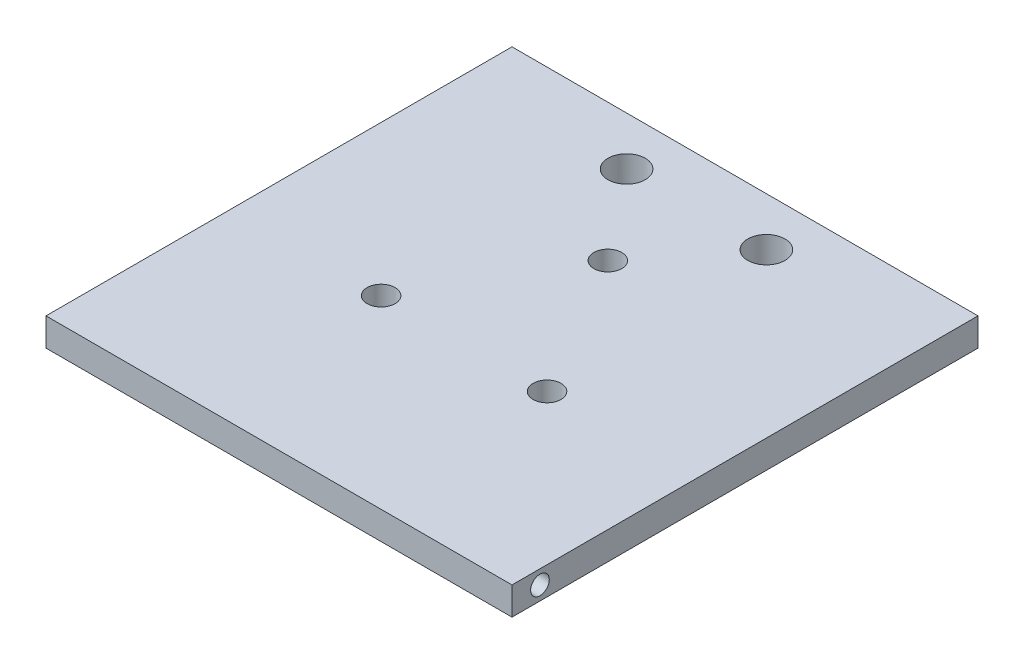
ISO-10303-21;
HEADER;
FILE_DESCRIPTION(('STEP AP214'),'2;1');
FILE_NAME('part.step','',(''),(''),'','','');
FILE_SCHEMA(('AUTOMOTIVE_DESIGN { 1 0 10303 214 1 1 1 1 }'));
ENDSEC;
DATA;
#1=APPLICATION_CONTEXT('core data for automotive mechanical design processes');
#2=APPLICATION_PROTOCOL_DEFINITION('international standard','automotive_design',2000,#1);
#3=PRODUCT_CONTEXT('',#1,'mechanical');
#4=PRODUCT('Part','Part','',(#3));
#5=PRODUCT_RELATED_PRODUCT_CATEGORY('part','',(#4));
#6=PRODUCT_DEFINITION_FORMATION('','',#4);
#7=PRODUCT_DEFINITION_CONTEXT('part definition',#1,'design');
#8=PRODUCT_DEFINITION('design','',#6,#7);
#9=PRODUCT_DEFINITION_SHAPE('','',#8);
#10=(LENGTH_UNIT() NAMED_UNIT(*) SI_UNIT(.MILLI.,.METRE.));
#11=(NAMED_UNIT(*) PLANE_ANGLE_UNIT() SI_UNIT($,.RADIAN.));
#12=(NAMED_UNIT(*) SI_UNIT($,.STERADIAN.) SOLID_ANGLE_UNIT());
#13=UNCERTAINTY_MEASURE_WITH_UNIT(LENGTH_MEASURE(1.E-05),#10,'distance_accuracy_value','');
#14=(GEOMETRIC_REPRESENTATION_CONTEXT(3) GLOBAL_UNCERTAINTY_ASSIGNED_CONTEXT((#13)) GLOBAL_UNIT_ASSIGNED_CONTEXT((#10,
#11,#12)) REPRESENTATION_CONTEXT('',''));
#15=CARTESIAN_POINT('',(0.,0.,0.));
#16=DIRECTION('',(0.,0.,1.));
#17=DIRECTION('',(1.,0.,0.));
#18=AXIS2_PLACEMENT_3D('',#15,#16,#17);
#19=CARTESIAN_POINT('',(0.,3.,0.));
#20=DIRECTION('',(0.,1.,0.));
#21=DIRECTION('',(0.,0.,1.));
#22=AXIS2_PLACEMENT_3D('',#19,#20,#21);
#23=PLANE('',#22);
#24=DIRECTION('',(1.,0.,0.));
#25=VECTOR('',#24,1.);
#26=CARTESIAN_POINT('',(0.,3.,25.));
#27=LINE('',#26,#25);
#28=CARTESIAN_POINT('',(-25.,3.,25.));
#29=VERTEX_POINT('',#28);
#30=CARTESIAN_POINT('',(25.,3.,25.));
#31=VERTEX_POINT('',#30);
#32=EDGE_CURVE('E98',#29,#31,#27,.T.);
#33=ORIENTED_EDGE('',*,*,#32,.T.);
#34=DIRECTION('',(0.,0.,-1.));
#35=VECTOR('',#34,1.);
#36=CARTESIAN_POINT('',(25.,3.,0.));
#37=LINE('',#36,#35);
#38=CARTESIAN_POINT('',(25.,3.,-25.));
#39=VERTEX_POINT('',#38);
#40=EDGE_CURVE('E90',#31,#39,#37,.T.);
#41=ORIENTED_EDGE('',*,*,#40,.T.);
#42=DIRECTION('',(1.,0.,0.));
#43=VECTOR('',#42,1.);
#44=CARTESIAN_POINT('',(0.,3.,-25.));
#45=LINE('',#44,#43);
#46=CARTESIAN_POINT('',(-25.,3.,-25.));
#47=VERTEX_POINT('',#46);
#48=EDGE_CURVE('E97',#47,#39,#45,.T.);
#49=ORIENTED_EDGE('',*,*,#48,.F.);
#50=DIRECTION('',(0.,0.,-1.));
#51=VECTOR('',#50,1.);
#52=CARTESIAN_POINT('',(-25.,3.,0.));
#53=LINE('',#52,#51);
#54=EDGE_CURVE('E110',#29,#47,#53,.T.);
#55=ORIENTED_EDGE('',*,*,#54,.F.);
#56=EDGE_LOOP('',(#33,#41,#49,#55));
#57=FACE_BOUND('',#56,.T.);
#58=CARTESIAN_POINT('',(8.90226981941188,3.,5.13972787663618));
#59=DIRECTION('',(0.,1.,0.));
#60=DIRECTION('',(0.,0.,1.));
#61=AXIS2_PLACEMENT_3D('',#58,#59,#60);
#62=CIRCLE('',#61,1.5);
#63=CARTESIAN_POINT('',(8.90226981941188,3.,6.63972787663618));
#64=VERTEX_POINT('',#63);
#65=EDGE_CURVE('E154',#64,#64,#62,.T.);
#66=ORIENTED_EDGE('',*,*,#65,.F.);
#67=EDGE_LOOP('',(#66));
#68=FACE_BOUND('',#67,.T.);
#69=CARTESIAN_POINT('',(0.,3.,-10.2794557532723));
#70=DIRECTION('',(0.,1.,0.));
#71=DIRECTION('',(0.,0.,1.));
#72=AXIS2_PLACEMENT_3D('',#69,#70,#71);
#73=CIRCLE('',#72,1.5);
#74=CARTESIAN_POINT('',(0.,3.,-8.77945575327228));
#75=VERTEX_POINT('',#74);
#76=EDGE_CURVE('E148',#75,#75,#73,.T.);
#77=ORIENTED_EDGE('',*,*,#76,.F.);
#78=EDGE_LOOP('',(#77));
#79=FACE_BOUND('',#78,.T.);
#80=CARTESIAN_POINT('',(-8.90226981941147,3.,5.13972787663639));
#81=DIRECTION('',(0.,1.,0.));
#82=DIRECTION('',(0.,0.,1.));
#83=AXIS2_PLACEMENT_3D('',#80,#81,#82);
#84=CIRCLE('',#83,1.50000000000057);
#85=CARTESIAN_POINT('',(-8.90226981941147,3.,6.63972787663696));
#86=VERTEX_POINT('',#85);
#87=EDGE_CURVE('E141',#86,#86,#84,.T.);
#88=ORIENTED_EDGE('',*,*,#87,.F.);
#89=EDGE_LOOP('',(#88));
#90=FACE_BOUND('',#89,.T.);
#91=CARTESIAN_POINT('',(7.50000000000002,3.,-19.7949177725713));
#92=DIRECTION('',(0.,1.,0.));
#93=DIRECTION('',(0.,0.,1.));
#94=AXIS2_PLACEMENT_3D('',#91,#92,#93);
#95=CIRCLE('',#94,2.);
#96=CARTESIAN_POINT('',(7.50000000000002,3.,-17.7949177725713));
#97=VERTEX_POINT('',#96);
#98=EDGE_CURVE('E177',#97,#97,#95,.T.);
#99=ORIENTED_EDGE('',*,*,#98,.F.);
#100=EDGE_LOOP('',(#99));
#101=FACE_BOUND('',#100,.T.);
#102=CARTESIAN_POINT('',(-7.5,3.,-19.7949177725713));
#103=DIRECTION('',(0.,1.,0.));
#104=DIRECTION('',(0.,0.,1.));
#105=AXIS2_PLACEMENT_3D('',#102,#103,#104);
#106=CIRCLE('',#105,2.);
#107=CARTESIAN_POINT('',(-7.5,3.,-17.7949177725713));
#108=VERTEX_POINT('',#107);
#109=EDGE_CURVE('E180',#108,#108,#106,.F.);
#110=ORIENTED_EDGE('',*,*,#109,.T.);
#111=EDGE_LOOP('',(#110));
#112=FACE_BOUND('',#111,.T.);
#113=ADVANCED_FACE('F47',(#57,#68,#79,#90,#101,#112),#23,.T.);
#114=CARTESIAN_POINT('',(0.,0.,0.));
#115=DIRECTION('',(0.,1.,0.));
#116=DIRECTION('',(0.,0.,1.));
#117=AXIS2_PLACEMENT_3D('',#114,#115,#116);
#118=PLANE('',#117);
#119=CARTESIAN_POINT('',(7.50000000000002,0.,-19.7949177725713));
#120=DIRECTION('',(0.,-1.,0.));
#121=DIRECTION('',(0.,0.,-1.));
#122=AXIS2_PLACEMENT_3D('',#119,#120,#121);
#123=CIRCLE('',#122,2.);
#124=CARTESIAN_POINT('',(7.50000000000002,0.,-21.7949177725713));
#125=VERTEX_POINT('',#124);
#126=EDGE_CURVE('E235',#125,#125,#123,.T.);
#127=ORIENTED_EDGE('',*,*,#126,.F.);
#128=EDGE_LOOP('',(#127));
#129=FACE_BOUND('',#128,.T.);
#130=CARTESIAN_POINT('',(-8.90226981941147,0.,5.13972787663639));
#131=DIRECTION('',(0.,1.,0.));
#132=DIRECTION('',(0.,0.,1.));
#133=AXIS2_PLACEMENT_3D('',#130,#131,#132);
#134=CIRCLE('',#133,1.50000000000057);
#135=CARTESIAN_POINT('',(-8.90226981941147,0.,6.63972787663696));
#136=VERTEX_POINT('',#135);
#137=EDGE_CURVE('E116',#136,#136,#134,.T.);
#138=ORIENTED_EDGE('',*,*,#137,.T.);
#139=EDGE_LOOP('',(#138));
#140=FACE_BOUND('',#139,.T.);
#141=CARTESIAN_POINT('',(0.,0.,-10.2794557532723));
#142=DIRECTION('',(0.,1.,0.));
#143=DIRECTION('',(0.,0.,1.));
#144=AXIS2_PLACEMENT_3D('',#141,#142,#143);
#145=CIRCLE('',#144,1.5);
#146=CARTESIAN_POINT('',(0.,0.,-8.77945575327228));
#147=VERTEX_POINT('',#146);
#148=EDGE_CURVE('E120',#147,#147,#145,.T.);
#149=ORIENTED_EDGE('',*,*,#148,.T.);
#150=EDGE_LOOP('',(#149));
#151=FACE_BOUND('',#150,.T.);
#152=CARTESIAN_POINT('',(8.90226981941188,0.,5.13972787663618));
#153=DIRECTION('',(0.,1.,0.));
#154=DIRECTION('',(0.,0.,1.));
#155=AXIS2_PLACEMENT_3D('',#152,#153,#154);
#156=CIRCLE('',#155,1.5);
#157=CARTESIAN_POINT('',(8.90226981941188,0.,6.63972787663618));
#158=VERTEX_POINT('',#157);
#159=EDGE_CURVE('E125',#158,#158,#156,.T.);
#160=ORIENTED_EDGE('',*,*,#159,.T.);
#161=EDGE_LOOP('',(#160));
#162=FACE_BOUND('',#161,.T.);
#163=DIRECTION('',(1.,0.,0.));
#164=VECTOR('',#163,1.);
#165=CARTESIAN_POINT('',(0.,0.,25.));
#166=LINE('',#165,#164);
#167=CARTESIAN_POINT('',(-25.,0.,25.));
#168=VERTEX_POINT('',#167);
#169=CARTESIAN_POINT('',(25.,0.,25.));
#170=VERTEX_POINT('',#169);
#171=EDGE_CURVE('E129',#168,#170,#166,.T.);
#172=ORIENTED_EDGE('',*,*,#171,.F.);
#173=DIRECTION('',(0.,0.,-1.));
#174=VECTOR('',#173,1.);
#175=CARTESIAN_POINT('',(-25.,0.,0.));
#176=LINE('',#175,#174);
#177=CARTESIAN_POINT('',(-25.,0.,-25.));
#178=VERTEX_POINT('',#177);
#179=EDGE_CURVE('E137',#168,#178,#176,.T.);
#180=ORIENTED_EDGE('',*,*,#179,.T.);
#181=DIRECTION('',(1.,0.,0.));
#182=VECTOR('',#181,1.);
#183=CARTESIAN_POINT('',(0.,0.,-25.));
#184=LINE('',#183,#182);
#185=CARTESIAN_POINT('',(25.,0.,-25.));
#186=VERTEX_POINT('',#185);
#187=EDGE_CURVE('E134',#178,#186,#184,.T.);
#188=ORIENTED_EDGE('',*,*,#187,.T.);
#189=DIRECTION('',(0.,0.,-1.));
#190=VECTOR('',#189,1.);
#191=CARTESIAN_POINT('',(25.,0.,0.));
#192=LINE('',#191,#190);
#193=EDGE_CURVE('E104',#170,#186,#192,.T.);
#194=ORIENTED_EDGE('',*,*,#193,.F.);
#195=EDGE_LOOP('',(#172,#180,#188,#194));
#196=FACE_BOUND('',#195,.T.);
#197=CARTESIAN_POINT('',(-7.5,0.,-19.7949177725713));
#198=DIRECTION('',(0.,-1.,0.));
#199=DIRECTION('',(0.,0.,-1.));
#200=AXIS2_PLACEMENT_3D('',#197,#198,#199);
#201=CIRCLE('',#200,2.);
#202=CARTESIAN_POINT('',(-7.5,0.,-21.7949177725713));
#203=VERTEX_POINT('',#202);
#204=EDGE_CURVE('E187',#203,#203,#201,.F.);
#205=ORIENTED_EDGE('',*,*,#204,.T.);
#206=EDGE_LOOP('',(#205));
#207=FACE_BOUND('',#206,.T.);
#208=ADVANCED_FACE('F169',(#129,#140,#151,#162,#196,#207),#118,.F.);
#209=CARTESIAN_POINT('',(0.,3.,25.));
#210=DIRECTION('',(0.,0.,-1.));
#211=DIRECTION('',(-1.,0.,0.));
#212=AXIS2_PLACEMENT_3D('',#209,#210,#211);
#213=PLANE('',#212);
#214=ORIENTED_EDGE('',*,*,#171,.T.);
#215=DIRECTION('',(0.,-1.,0.));
#216=VECTOR('',#215,1.);
#217=CARTESIAN_POINT('',(25.,3.,25.));
#218=LINE('',#217,#216);
#219=EDGE_CURVE('E11',#31,#170,#218,.T.);
#220=ORIENTED_EDGE('',*,*,#219,.F.);
#221=ORIENTED_EDGE('',*,*,#32,.F.);
#222=DIRECTION('',(0.,-1.,0.));
#223=VECTOR('',#222,1.);
#224=CARTESIAN_POINT('',(-25.,3.,25.));
#225=LINE('',#224,#223);
#226=EDGE_CURVE('E65',#29,#168,#225,.T.);
#227=ORIENTED_EDGE('',*,*,#226,.T.);
#228=EDGE_LOOP('',(#214,#220,#221,#227));
#229=FACE_BOUND('',#228,.T.);
#230=ADVANCED_FACE('F204',(#229),#213,.F.);
#231=CARTESIAN_POINT('',(25.,3.,0.));
#232=DIRECTION('',(-1.,0.,0.));
#233=DIRECTION('',(0.,0.,1.));
#234=AXIS2_PLACEMENT_3D('',#231,#232,#233);
#235=PLANE('',#234);
#236=CARTESIAN_POINT('',(25.,1.5,22.));
#237=DIRECTION('',(1.,0.,0.));
#238=DIRECTION('',(0.,0.,-1.));
#239=AXIS2_PLACEMENT_3D('',#236,#237,#238);
#240=CIRCLE('',#239,1.);
#241=CARTESIAN_POINT('',(25.,1.5,21.));
#242=VERTEX_POINT('',#241);
#243=EDGE_CURVE('E157',#242,#242,#240,.T.);
#244=ORIENTED_EDGE('',*,*,#243,.F.);
#245=EDGE_LOOP('',(#244));
#246=FACE_BOUND('',#245,.T.);
#247=ORIENTED_EDGE('',*,*,#193,.T.);
#248=DIRECTION('',(0.,-1.,0.));
#249=VECTOR('',#248,1.);
#250=CARTESIAN_POINT('',(25.,3.,-25.));
#251=LINE('',#250,#249);
#252=EDGE_CURVE('E57',#39,#186,#251,.T.);
#253=ORIENTED_EDGE('',*,*,#252,.F.);
#254=ORIENTED_EDGE('',*,*,#40,.F.);
#255=ORIENTED_EDGE('',*,*,#219,.T.);
#256=EDGE_LOOP('',(#247,#253,#254,#255));
#257=FACE_BOUND('',#256,.T.);
#258=ADVANCED_FACE('F103',(#246,#257),#235,.F.);
#259=CARTESIAN_POINT('',(0.,3.,-25.));
#260=DIRECTION('',(0.,0.,-1.));
#261=DIRECTION('',(-1.,0.,0.));
#262=AXIS2_PLACEMENT_3D('',#259,#260,#261);
#263=PLANE('',#262);
#264=ORIENTED_EDGE('',*,*,#187,.F.);
#265=DIRECTION('',(0.,-1.,0.));
#266=VECTOR('',#265,1.);
#267=CARTESIAN_POINT('',(-25.,3.,-25.));
#268=LINE('',#267,#266);
#269=EDGE_CURVE('E79',#47,#178,#268,.T.);
#270=ORIENTED_EDGE('',*,*,#269,.F.);
#271=ORIENTED_EDGE('',*,*,#48,.T.);
#272=ORIENTED_EDGE('',*,*,#252,.T.);
#273=EDGE_LOOP('',(#264,#270,#271,#272));
#274=FACE_BOUND('',#273,.T.);
#275=ADVANCED_FACE('F108',(#274),#263,.T.);
#276=CARTESIAN_POINT('',(8.90226981941188,3.,5.13972787663618));
#277=DIRECTION('',(0.,-1.,0.));
#278=DIRECTION('',(0.,0.,-1.));
#279=AXIS2_PLACEMENT_3D('',#276,#277,#278);
#280=CYLINDRICAL_SURFACE('',#279,1.5);
#281=ORIENTED_EDGE('',*,*,#65,.T.);
#282=EDGE_LOOP('',(#281));
#283=FACE_BOUND('',#282,.T.);
#284=ORIENTED_EDGE('',*,*,#159,.F.);
#285=EDGE_LOOP('',(#284));
#286=FACE_BOUND('',#285,.T.);
#287=ADVANCED_FACE('F165',(#283,#286),#280,.F.);
#288=CARTESIAN_POINT('',(0.,3.,-10.2794557532723));
#289=DIRECTION('',(0.,-1.,0.));
#290=DIRECTION('',(0.,0.,-1.));
#291=AXIS2_PLACEMENT_3D('',#288,#289,#290);
#292=CYLINDRICAL_SURFACE('',#291,1.5);
#293=ORIENTED_EDGE('',*,*,#76,.T.);
#294=EDGE_LOOP('',(#293));
#295=FACE_BOUND('',#294,.T.);
#296=ORIENTED_EDGE('',*,*,#148,.F.);
#297=EDGE_LOOP('',(#296));
#298=FACE_BOUND('',#297,.T.);
#299=ADVANCED_FACE('F217',(#295,#298),#292,.F.);
#300=CARTESIAN_POINT('',(-8.90226981941147,3.,5.13972787663639));
#301=DIRECTION('',(0.,-1.,0.));
#302=DIRECTION('',(0.,0.,-1.));
#303=AXIS2_PLACEMENT_3D('',#300,#301,#302);
#304=CYLINDRICAL_SURFACE('',#303,1.50000000000057);
#305=ORIENTED_EDGE('',*,*,#87,.T.);
#306=EDGE_LOOP('',(#305));
#307=FACE_BOUND('',#306,.T.);
#308=ORIENTED_EDGE('',*,*,#137,.F.);
#309=EDGE_LOOP('',(#308));
#310=FACE_BOUND('',#309,.T.);
#311=ADVANCED_FACE('F49',(#307,#310),#304,.F.);
#312=CARTESIAN_POINT('',(-25.,3.,0.));
#313=DIRECTION('',(-1.,0.,0.));
#314=DIRECTION('',(0.,0.,1.));
#315=AXIS2_PLACEMENT_3D('',#312,#313,#314);
#316=PLANE('',#315);
#317=CARTESIAN_POINT('',(-25.,1.5,22.));
#318=DIRECTION('',(1.,0.,0.));
#319=DIRECTION('',(0.,0.,-1.));
#320=AXIS2_PLACEMENT_3D('',#317,#318,#319);
#321=CIRCLE('',#320,1.);
#322=CARTESIAN_POINT('',(-25.,1.5,21.));
#323=VERTEX_POINT('',#322);
#324=EDGE_CURVE('E121',#323,#323,#321,.T.);
#325=ORIENTED_EDGE('',*,*,#324,.T.);
#326=EDGE_LOOP('',(#325));
#327=FACE_BOUND('',#326,.T.);
#328=ORIENTED_EDGE('',*,*,#179,.F.);
#329=ORIENTED_EDGE('',*,*,#226,.F.);
#330=ORIENTED_EDGE('',*,*,#54,.T.);
#331=ORIENTED_EDGE('',*,*,#269,.T.);
#332=EDGE_LOOP('',(#328,#329,#330,#331));
#333=FACE_BOUND('',#332,.T.);
#334=ADVANCED_FACE('F194',(#327,#333),#316,.T.);
#335=CARTESIAN_POINT('',(-25.,1.5,22.));
#336=DIRECTION('',(1.,0.,0.));
#337=DIRECTION('',(0.,0.,-1.));
#338=AXIS2_PLACEMENT_3D('',#335,#336,#337);
#339=CYLINDRICAL_SURFACE('',#338,1.);
#340=ORIENTED_EDGE('',*,*,#324,.F.);
#341=EDGE_LOOP('',(#340));
#342=FACE_BOUND('',#341,.T.);
#343=ORIENTED_EDGE('',*,*,#243,.T.);
#344=EDGE_LOOP('',(#343));
#345=FACE_BOUND('',#344,.T.);
#346=ADVANCED_FACE('F196',(#342,#345),#339,.F.);
#347=CARTESIAN_POINT('',(7.50000000000002,50.,-19.7949177725713));
#348=DIRECTION('',(0.,-1.,0.));
#349=DIRECTION('',(0.,0.,-1.));
#350=AXIS2_PLACEMENT_3D('',#347,#348,#349);
#351=CYLINDRICAL_SURFACE('',#350,2.);
#352=ORIENTED_EDGE('',*,*,#98,.T.);
#353=EDGE_LOOP('',(#352));
#354=FACE_BOUND('',#353,.T.);
#355=ORIENTED_EDGE('',*,*,#126,.T.);
#356=EDGE_LOOP('',(#355));
#357=FACE_BOUND('',#356,.T.);
#358=ADVANCED_FACE('F199',(#354,#357),#351,.F.);
#359=CARTESIAN_POINT('',(-7.5,50.,-19.7949177725713));
#360=DIRECTION('',(0.,-1.,0.));
#361=DIRECTION('',(0.,0.,-1.));
#362=AXIS2_PLACEMENT_3D('',#359,#360,#361);
#363=CYLINDRICAL_SURFACE('',#362,2.);
#364=ORIENTED_EDGE('',*,*,#109,.F.);
#365=EDGE_LOOP('',(#364));
#366=FACE_BOUND('',#365,.T.);
#367=ORIENTED_EDGE('',*,*,#204,.F.);
#368=EDGE_LOOP('',(#367));
#369=FACE_BOUND('',#368,.T.);
#370=ADVANCED_FACE('F245',(#366,#369),#363,.F.);
#371=CLOSED_SHELL('',(#113,#208,#230,#258,#275,#287,#299,#311,#334,#346,#358,#370));
#372=MANIFOLD_SOLID_BREP('B2',#371);
#373=ADVANCED_BREP_SHAPE_REPRESENTATION('',(#18,#372),#14);
#374=SHAPE_DEFINITION_REPRESENTATION(#9,#373);
ENDSEC;
END-ISO-10303-21;
